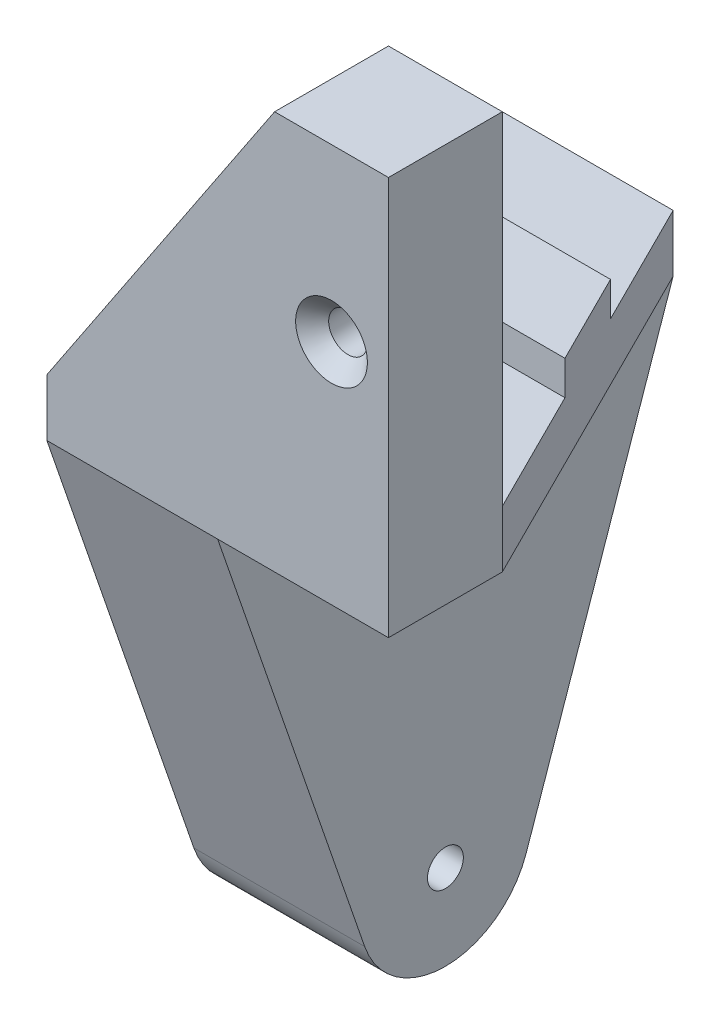
ISO-10303-21;
HEADER;
FILE_DESCRIPTION(('STEP AP214'),'2;1');
FILE_NAME('part.step','',(''),(''),'','','');
FILE_SCHEMA(('AUTOMOTIVE_DESIGN { 1 0 10303 214 1 1 1 1 }'));
ENDSEC;
DATA;
#1=APPLICATION_CONTEXT('core data for automotive mechanical design processes');
#2=APPLICATION_PROTOCOL_DEFINITION('international standard','automotive_design',2000,#1);
#3=PRODUCT_CONTEXT('',#1,'mechanical');
#4=PRODUCT('Part','Part','',(#3));
#5=PRODUCT_RELATED_PRODUCT_CATEGORY('part','',(#4));
#6=PRODUCT_DEFINITION_FORMATION('','',#4);
#7=PRODUCT_DEFINITION_CONTEXT('part definition',#1,'design');
#8=PRODUCT_DEFINITION('design','',#6,#7);
#9=PRODUCT_DEFINITION_SHAPE('','',#8);
#10=(LENGTH_UNIT() NAMED_UNIT(*) SI_UNIT(.MILLI.,.METRE.));
#11=(NAMED_UNIT(*) PLANE_ANGLE_UNIT() SI_UNIT($,.RADIAN.));
#12=(NAMED_UNIT(*) SI_UNIT($,.STERADIAN.) SOLID_ANGLE_UNIT());
#13=UNCERTAINTY_MEASURE_WITH_UNIT(LENGTH_MEASURE(1.E-05),#10,'distance_accuracy_value','');
#14=(GEOMETRIC_REPRESENTATION_CONTEXT(3) GLOBAL_UNCERTAINTY_ASSIGNED_CONTEXT((#13)) GLOBAL_UNIT_ASSIGNED_CONTEXT((#10,
#11,#12)) REPRESENTATION_CONTEXT('',''));
#15=CARTESIAN_POINT('',(0.,0.,0.));
#16=DIRECTION('',(0.,0.,1.));
#17=DIRECTION('',(1.,0.,0.));
#18=AXIS2_PLACEMENT_3D('',#15,#16,#17);
#19=CARTESIAN_POINT('',(0.,-5.,10.));
#20=DIRECTION('',(1.,0.,0.));
#21=DIRECTION('',(0.,0.,-1.));
#22=AXIS2_PLACEMENT_3D('',#19,#20,#21);
#23=PLANE('',#22);
#24=DIRECTION('',(0.,0.,-1.));
#25=VECTOR('',#24,1.);
#26=CARTESIAN_POINT('',(0.,0.,10.));
#27=LINE('',#26,#25);
#28=CARTESIAN_POINT('',(0.,0.,10.));
#29=VERTEX_POINT('',#28);
#30=CARTESIAN_POINT('',(0.,0.,0.));
#31=VERTEX_POINT('',#30);
#32=EDGE_CURVE('E236',#29,#31,#27,.T.);
#33=ORIENTED_EDGE('',*,*,#32,.T.);
#34=DIRECTION('',(0.,0.,-1.));
#35=VECTOR('',#34,1.);
#36=CARTESIAN_POINT('',(0.,0.,10.));
#37=LINE('',#36,#35);
#38=CARTESIAN_POINT('',(0.,0.,-11.));
#39=VERTEX_POINT('',#38);
#40=EDGE_CURVE('E167',#31,#39,#37,.T.);
#41=ORIENTED_EDGE('',*,*,#40,.T.);
#42=DIRECTION('',(0.,-1.,0.));
#43=VECTOR('',#42,1.);
#44=CARTESIAN_POINT('',(0.,3.,-11.));
#45=LINE('',#44,#43);
#46=CARTESIAN_POINT('',(0.,3.,-11.));
#47=VERTEX_POINT('',#46);
#48=EDGE_CURVE('E148',#47,#39,#45,.T.);
#49=ORIENTED_EDGE('',*,*,#48,.F.);
#50=DIRECTION('',(0.,0.,1.));
#51=VECTOR('',#50,1.);
#52=CARTESIAN_POINT('',(0.,3.,-11.));
#53=LINE('',#52,#51);
#54=CARTESIAN_POINT('',(0.,3.,-19.));
#55=VERTEX_POINT('',#54);
#56=EDGE_CURVE('E152',#55,#47,#53,.T.);
#57=ORIENTED_EDGE('',*,*,#56,.F.);
#58=DIRECTION('',(0.,-1.,0.));
#59=VECTOR('',#58,1.);
#60=CARTESIAN_POINT('',(0.,3.,-19.));
#61=LINE('',#60,#59);
#62=CARTESIAN_POINT('',(0.,0.,-19.));
#63=VERTEX_POINT('',#62);
#64=EDGE_CURVE('E308',#55,#63,#61,.T.);
#65=ORIENTED_EDGE('',*,*,#64,.T.);
#66=CARTESIAN_POINT('',(0.,0.,-30.));
#67=VERTEX_POINT('',#66);
#68=EDGE_CURVE('E197',#63,#67,#37,.T.);
#69=ORIENTED_EDGE('',*,*,#68,.T.);
#70=DIRECTION('',(0.,1.,0.));
#71=VECTOR('',#70,1.);
#72=CARTESIAN_POINT('',(0.,-5.,-30.));
#73=LINE('',#72,#71);
#74=CARTESIAN_POINT('',(0.,-5.,-30.));
#75=VERTEX_POINT('',#74);
#76=EDGE_CURVE('E228',#75,#67,#73,.T.);
#77=ORIENTED_EDGE('',*,*,#76,.F.);
#78=DIRECTION('',(0.,-0.945391204802185,0.325937831315534));
#79=VECTOR('',#78,1.);
#80=CARTESIAN_POINT('',(0.,-5.,-30.));
#81=LINE('',#80,#79);
#82=CARTESIAN_POINT('',(0.,-42.4445337348665,-17.0904340360164));
#83=VERTEX_POINT('',#82);
#84=EDGE_CURVE('E168',#75,#83,#81,.T.);
#85=ORIENTED_EDGE('',*,*,#84,.T.);
#86=CARTESIAN_POINT('',(0.,-40.,-10.));
#87=DIRECTION('',(-1.,0.,0.));
#88=DIRECTION('',(0.,0.,1.));
#89=AXIS2_PLACEMENT_3D('',#86,#87,#88);
#90=CIRCLE('',#89,7.5);
#91=CARTESIAN_POINT('',(0.,-42.4445337348665,-2.90956596398362));
#92=VERTEX_POINT('',#91);
#93=EDGE_CURVE('E171',#83,#92,#90,.T.);
#94=ORIENTED_EDGE('',*,*,#93,.T.);
#95=DIRECTION('',(0.,0.945391204802185,0.325937831315534));
#96=VECTOR('',#95,1.);
#97=CARTESIAN_POINT('',(0.,-5.,10.));
#98=LINE('',#97,#96);
#99=CARTESIAN_POINT('',(0.,-5.,10.));
#100=VERTEX_POINT('',#99);
#101=EDGE_CURVE('E181',#92,#100,#98,.T.);
#102=ORIENTED_EDGE('',*,*,#101,.T.);
#103=DIRECTION('',(0.,1.,0.));
#104=VECTOR('',#103,1.);
#105=CARTESIAN_POINT('',(0.,-5.,10.));
#106=LINE('',#105,#104);
#107=EDGE_CURVE('E213',#100,#29,#106,.T.);
#108=ORIENTED_EDGE('',*,*,#107,.T.);
#109=EDGE_LOOP('',(#33,#41,#49,#57,#65,#69,#77,#85,#94,#102,#108));
#110=FACE_BOUND('',#109,.T.);
#111=CARTESIAN_POINT('',(0.,-40.,-10.));
#112=DIRECTION('',(-1.,0.,0.));
#113=DIRECTION('',(0.,0.,1.));
#114=AXIS2_PLACEMENT_3D('',#111,#112,#113);
#115=CIRCLE('',#114,1.575);
#116=CARTESIAN_POINT('',(0.,-40.,-8.425));
#117=VERTEX_POINT('',#116);
#118=EDGE_CURVE('E492',#117,#117,#115,.T.);
#119=ORIENTED_EDGE('',*,*,#118,.F.);
#120=EDGE_LOOP('',(#119));
#121=FACE_BOUND('',#120,.T.);
#122=ADVANCED_FACE('F38',(#110,#121),#23,.F.);
#123=CARTESIAN_POINT('',(0.,0.,0.));
#124=DIRECTION('',(0.,-1.,0.));
#125=DIRECTION('',(0.,0.,-1.));
#126=AXIS2_PLACEMENT_3D('',#123,#124,#125);
#127=PLANE('',#126);
#128=DIRECTION('',(1.,0.,0.));
#129=VECTOR('',#128,1.);
#130=CARTESIAN_POINT('',(0.,0.,-11.));
#131=LINE('',#130,#129);
#132=CARTESIAN_POINT('',(24.5,0.,-11.));
#133=VERTEX_POINT('',#132);
#134=EDGE_CURVE('E255',#39,#133,#131,.T.);
#135=ORIENTED_EDGE('',*,*,#134,.F.);
#136=ORIENTED_EDGE('',*,*,#40,.F.);
#137=DIRECTION('',(1.,0.,0.));
#138=VECTOR('',#137,1.);
#139=CARTESIAN_POINT('',(0.,0.,0.));
#140=LINE('',#139,#138);
#141=CARTESIAN_POINT('',(30.,0.,0.));
#142=VERTEX_POINT('',#141);
#143=EDGE_CURVE('E231',#31,#142,#140,.T.);
#144=ORIENTED_EDGE('',*,*,#143,.T.);
#145=DIRECTION('',(0.447213595499958,0.,0.894427190999916));
#146=VECTOR('',#145,1.);
#147=CARTESIAN_POINT('',(15.,0.,-30.));
#148=LINE('',#147,#146);
#149=EDGE_CURVE('E217',#133,#142,#148,.T.);
#150=ORIENTED_EDGE('',*,*,#149,.F.);
#151=EDGE_LOOP('',(#135,#136,#144,#150));
#152=FACE_BOUND('',#151,.T.);
#153=ADVANCED_FACE('F254',(#152),#127,.F.);
#154=DIRECTION('',(-1.,0.,0.));
#155=VECTOR('',#154,1.);
#156=CARTESIAN_POINT('',(0.,0.,-19.));
#157=LINE('',#156,#155);
#158=CARTESIAN_POINT('',(20.5,0.,-19.));
#159=VERTEX_POINT('',#158);
#160=EDGE_CURVE('E161',#159,#63,#157,.T.);
#161=ORIENTED_EDGE('',*,*,#160,.F.);
#162=CARTESIAN_POINT('',(15.,0.,-30.));
#163=VERTEX_POINT('',#162);
#164=EDGE_CURVE('E205',#163,#159,#148,.T.);
#165=ORIENTED_EDGE('',*,*,#164,.F.);
#166=DIRECTION('',(1.,0.,0.));
#167=VECTOR('',#166,1.);
#168=CARTESIAN_POINT('',(0.,0.,-30.));
#169=LINE('',#168,#167);
#170=EDGE_CURVE('E215',#67,#163,#169,.T.);
#171=ORIENTED_EDGE('',*,*,#170,.F.);
#172=ORIENTED_EDGE('',*,*,#68,.F.);
#173=EDGE_LOOP('',(#161,#165,#171,#172));
#174=FACE_BOUND('',#173,.T.);
#175=ADVANCED_FACE('F279',(#174),#127,.F.);
#176=CARTESIAN_POINT('',(0.,-5.,0.));
#177=DIRECTION('',(0.,-1.,0.));
#178=DIRECTION('',(0.,0.,-1.));
#179=AXIS2_PLACEMENT_3D('',#176,#177,#178);
#180=PLANE('',#179);
#181=DIRECTION('',(-1.,0.,0.));
#182=VECTOR('',#181,1.);
#183=CARTESIAN_POINT('',(0.,-5.,10.));
#184=LINE('',#183,#182);
#185=CARTESIAN_POINT('',(30.,-5.,10.));
#186=VERTEX_POINT('',#185);
#187=CARTESIAN_POINT('',(15.,-5.,10.));
#188=VERTEX_POINT('',#187);
#189=EDGE_CURVE('E210',#186,#188,#184,.T.);
#190=ORIENTED_EDGE('',*,*,#189,.T.);
#191=DIRECTION('',(0.,0.,-1.));
#192=VECTOR('',#191,1.);
#193=CARTESIAN_POINT('',(15.,-5.,-30.));
#194=LINE('',#193,#192);
#195=CARTESIAN_POINT('',(15.,-5.,-30.));
#196=VERTEX_POINT('',#195);
#197=EDGE_CURVE('E177',#188,#196,#194,.T.);
#198=ORIENTED_EDGE('',*,*,#197,.T.);
#199=DIRECTION('',(0.447213595499958,0.,0.894427190999916));
#200=VECTOR('',#199,1.);
#201=CARTESIAN_POINT('',(15.,-5.,-30.));
#202=LINE('',#201,#200);
#203=CARTESIAN_POINT('',(30.,-5.,0.));
#204=VERTEX_POINT('',#203);
#205=EDGE_CURVE('E204',#196,#204,#202,.T.);
#206=ORIENTED_EDGE('',*,*,#205,.T.);
#207=DIRECTION('',(0.,0.,1.));
#208=VECTOR('',#207,1.);
#209=CARTESIAN_POINT('',(30.,-5.,10.));
#210=LINE('',#209,#208);
#211=EDGE_CURVE('E207',#204,#186,#210,.T.);
#212=ORIENTED_EDGE('',*,*,#211,.T.);
#213=EDGE_LOOP('',(#190,#198,#206,#212));
#214=FACE_BOUND('',#213,.T.);
#215=ADVANCED_FACE('F261',(#214),#180,.T.);
#216=CARTESIAN_POINT('',(30.,0.,10.));
#217=DIRECTION('',(-1.,0.,0.));
#218=DIRECTION('',(0.,0.,1.));
#219=AXIS2_PLACEMENT_3D('',#216,#217,#218);
#220=PLANE('',#219);
#221=DIRECTION('',(0.,1.,0.));
#222=VECTOR('',#221,1.);
#223=CARTESIAN_POINT('',(30.,0.,0.));
#224=LINE('',#223,#222);
#225=CARTESIAN_POINT('',(30.,30.,0.));
#226=VERTEX_POINT('',#225);
#227=EDGE_CURVE('E239',#142,#226,#224,.T.);
#228=ORIENTED_EDGE('',*,*,#227,.T.);
#229=DIRECTION('',(0.,0.,-1.));
#230=VECTOR('',#229,1.);
#231=CARTESIAN_POINT('',(30.,30.,10.));
#232=LINE('',#231,#230);
#233=CARTESIAN_POINT('',(30.,30.,10.));
#234=VERTEX_POINT('',#233);
#235=EDGE_CURVE('E11',#234,#226,#232,.T.);
#236=ORIENTED_EDGE('',*,*,#235,.F.);
#237=DIRECTION('',(0.,1.,0.));
#238=VECTOR('',#237,1.);
#239=CARTESIAN_POINT('',(30.,0.,10.));
#240=LINE('',#239,#238);
#241=EDGE_CURVE('E84',#186,#234,#240,.T.);
#242=ORIENTED_EDGE('',*,*,#241,.F.);
#243=ORIENTED_EDGE('',*,*,#211,.F.);
#244=DIRECTION('',(0.,1.,0.));
#245=VECTOR('',#244,1.);
#246=CARTESIAN_POINT('',(30.,-5.,0.));
#247=LINE('',#246,#245);
#248=EDGE_CURVE('E222',#204,#142,#247,.T.);
#249=ORIENTED_EDGE('',*,*,#248,.T.);
#250=EDGE_LOOP('',(#228,#236,#242,#243,#249));
#251=FACE_BOUND('',#250,.T.);
#252=ADVANCED_FACE('F40',(#251),#220,.F.);
#253=CARTESIAN_POINT('',(20.,30.,10.));
#254=DIRECTION('',(0.,-1.,0.));
#255=DIRECTION('',(0.,0.,-1.));
#256=AXIS2_PLACEMENT_3D('',#253,#254,#255);
#257=PLANE('',#256);
#258=DIRECTION('',(-1.,0.,0.));
#259=VECTOR('',#258,1.);
#260=CARTESIAN_POINT('',(20.,30.,0.));
#261=LINE('',#260,#259);
#262=CARTESIAN_POINT('',(20.,30.,0.));
#263=VERTEX_POINT('',#262);
#264=EDGE_CURVE('E241',#226,#263,#261,.T.);
#265=ORIENTED_EDGE('',*,*,#264,.T.);
#266=DIRECTION('',(0.,0.,-1.));
#267=VECTOR('',#266,1.);
#268=CARTESIAN_POINT('',(20.,30.,10.));
#269=LINE('',#268,#267);
#270=CARTESIAN_POINT('',(20.,30.,10.));
#271=VERTEX_POINT('',#270);
#272=EDGE_CURVE('E46',#271,#263,#269,.T.);
#273=ORIENTED_EDGE('',*,*,#272,.F.);
#274=DIRECTION('',(-1.,0.,0.));
#275=VECTOR('',#274,1.);
#276=CARTESIAN_POINT('',(20.,30.,10.));
#277=LINE('',#276,#275);
#278=EDGE_CURVE('E233',#234,#271,#277,.T.);
#279=ORIENTED_EDGE('',*,*,#278,.F.);
#280=ORIENTED_EDGE('',*,*,#235,.T.);
#281=EDGE_LOOP('',(#265,#273,#279,#280));
#282=FACE_BOUND('',#281,.T.);
#283=ADVANCED_FACE('F267',(#282),#257,.F.);
#284=CARTESIAN_POINT('',(0.,0.,10.));
#285=DIRECTION('',(0.832050294337844,-0.554700196225229,0.));
#286=DIRECTION('',(0.554700196225229,0.832050294337844,0.));
#287=AXIS2_PLACEMENT_3D('',#284,#285,#286);
#288=PLANE('',#287);
#289=DIRECTION('',(-0.554700196225229,-0.832050294337844,0.));
#290=VECTOR('',#289,1.);
#291=CARTESIAN_POINT('',(0.,0.,0.));
#292=LINE('',#291,#290);
#293=EDGE_CURVE('E79',#263,#31,#292,.T.);
#294=ORIENTED_EDGE('',*,*,#293,.T.);
#295=ORIENTED_EDGE('',*,*,#32,.F.);
#296=DIRECTION('',(-0.554700196225229,-0.832050294337844,0.));
#297=VECTOR('',#296,1.);
#298=CARTESIAN_POINT('',(0.,0.,10.));
#299=LINE('',#298,#297);
#300=EDGE_CURVE('E62',#271,#29,#299,.T.);
#301=ORIENTED_EDGE('',*,*,#300,.F.);
#302=ORIENTED_EDGE('',*,*,#272,.T.);
#303=EDGE_LOOP('',(#294,#295,#301,#302));
#304=FACE_BOUND('',#303,.T.);
#305=ADVANCED_FACE('F245',(#304),#288,.F.);
#306=CARTESIAN_POINT('',(0.,0.,10.));
#307=DIRECTION('',(0.,0.,1.));
#308=DIRECTION('',(1.,0.,0.));
#309=AXIS2_PLACEMENT_3D('',#306,#307,#308);
#310=PLANE('',#309);
#311=CARTESIAN_POINT('',(25.,15.,10.));
#312=DIRECTION('',(0.,0.,1.));
#313=DIRECTION('',(1.,0.,0.));
#314=AXIS2_PLACEMENT_3D('',#311,#312,#313);
#315=CIRCLE('',#314,3.15);
#316=CARTESIAN_POINT('',(28.15,15.,10.));
#317=VERTEX_POINT('',#316);
#318=EDGE_CURVE('E303',#317,#317,#315,.T.);
#319=ORIENTED_EDGE('',*,*,#318,.F.);
#320=EDGE_LOOP('',(#319));
#321=FACE_BOUND('',#320,.T.);
#322=ORIENTED_EDGE('',*,*,#300,.T.);
#323=ORIENTED_EDGE('',*,*,#107,.F.);
#324=DIRECTION('',(-1.,0.,0.));
#325=VECTOR('',#324,1.);
#326=CARTESIAN_POINT('',(15.,-5.,10.));
#327=LINE('',#326,#325);
#328=EDGE_CURVE('E195',#188,#100,#327,.T.);
#329=ORIENTED_EDGE('',*,*,#328,.F.);
#330=ORIENTED_EDGE('',*,*,#189,.F.);
#331=ORIENTED_EDGE('',*,*,#241,.T.);
#332=ORIENTED_EDGE('',*,*,#278,.T.);
#333=EDGE_LOOP('',(#322,#323,#329,#330,#331,#332));
#334=FACE_BOUND('',#333,.T.);
#335=ADVANCED_FACE('F258',(#321,#334),#310,.T.);
#336=CARTESIAN_POINT('',(0.,0.,0.));
#337=DIRECTION('',(0.,0.,1.));
#338=DIRECTION('',(1.,0.,0.));
#339=AXIS2_PLACEMENT_3D('',#336,#337,#338);
#340=PLANE('',#339);
#341=CARTESIAN_POINT('',(25.,15.,0.));
#342=DIRECTION('',(0.,0.,1.));
#343=DIRECTION('',(1.,0.,0.));
#344=AXIS2_PLACEMENT_3D('',#341,#342,#343);
#345=CIRCLE('',#344,1.7);
#346=CARTESIAN_POINT('',(26.7,15.,0.));
#347=VERTEX_POINT('',#346);
#348=EDGE_CURVE('E297',#347,#347,#345,.T.);
#349=ORIENTED_EDGE('',*,*,#348,.T.);
#350=EDGE_LOOP('',(#349));
#351=FACE_BOUND('',#350,.T.);
#352=ORIENTED_EDGE('',*,*,#143,.F.);
#353=ORIENTED_EDGE('',*,*,#293,.F.);
#354=ORIENTED_EDGE('',*,*,#264,.F.);
#355=ORIENTED_EDGE('',*,*,#227,.F.);
#356=EDGE_LOOP('',(#352,#353,#354,#355));
#357=FACE_BOUND('',#356,.T.);
#358=ADVANCED_FACE('F250',(#351,#357),#340,.F.);
#359=CARTESIAN_POINT('',(0.,-5.,-30.));
#360=DIRECTION('',(0.,0.,1.));
#361=DIRECTION('',(1.,0.,0.));
#362=AXIS2_PLACEMENT_3D('',#359,#360,#361);
#363=PLANE('',#362);
#364=ORIENTED_EDGE('',*,*,#170,.T.);
#365=DIRECTION('',(0.,1.,0.));
#366=VECTOR('',#365,1.);
#367=CARTESIAN_POINT('',(15.,-5.,-30.));
#368=LINE('',#367,#366);
#369=EDGE_CURVE('E225',#196,#163,#368,.T.);
#370=ORIENTED_EDGE('',*,*,#369,.F.);
#371=DIRECTION('',(1.,0.,0.));
#372=VECTOR('',#371,1.);
#373=CARTESIAN_POINT('',(0.,-5.,-30.));
#374=LINE('',#373,#372);
#375=EDGE_CURVE('E201',#75,#196,#374,.T.);
#376=ORIENTED_EDGE('',*,*,#375,.F.);
#377=ORIENTED_EDGE('',*,*,#76,.T.);
#378=EDGE_LOOP('',(#364,#370,#376,#377));
#379=FACE_BOUND('',#378,.T.);
#380=ADVANCED_FACE('F283',(#379),#363,.F.);
#381=CARTESIAN_POINT('',(15.,-5.,-30.));
#382=DIRECTION('',(-0.894427190999916,0.,0.447213595499958));
#383=DIRECTION('',(0.447213595499958,0.,0.894427190999916));
#384=AXIS2_PLACEMENT_3D('',#381,#382,#383);
#385=PLANE('',#384);
#386=ORIENTED_EDGE('',*,*,#164,.T.);
#387=DIRECTION('',(0.,-1.,0.));
#388=VECTOR('',#387,1.);
#389=CARTESIAN_POINT('',(20.5,3.,-19.));
#390=LINE('',#389,#388);
#391=CARTESIAN_POINT('',(20.5,3.,-19.));
#392=VERTEX_POINT('',#391);
#393=EDGE_CURVE('E173',#392,#159,#390,.T.);
#394=ORIENTED_EDGE('',*,*,#393,.F.);
#395=DIRECTION('',(-0.447213595499958,0.,-0.894427190999916));
#396=VECTOR('',#395,1.);
#397=CARTESIAN_POINT('',(20.5,3.,-19.));
#398=LINE('',#397,#396);
#399=CARTESIAN_POINT('',(24.5,3.,-11.));
#400=VERTEX_POINT('',#399);
#401=EDGE_CURVE('E151',#400,#392,#398,.T.);
#402=ORIENTED_EDGE('',*,*,#401,.F.);
#403=DIRECTION('',(0.,-1.,0.));
#404=VECTOR('',#403,1.);
#405=CARTESIAN_POINT('',(24.5,3.,-11.));
#406=LINE('',#405,#404);
#407=EDGE_CURVE('E53',#400,#133,#406,.T.);
#408=ORIENTED_EDGE('',*,*,#407,.T.);
#409=ORIENTED_EDGE('',*,*,#149,.T.);
#410=ORIENTED_EDGE('',*,*,#248,.F.);
#411=ORIENTED_EDGE('',*,*,#205,.F.);
#412=ORIENTED_EDGE('',*,*,#369,.T.);
#413=EDGE_LOOP('',(#386,#394,#402,#408,#409,#410,#411,#412));
#414=FACE_BOUND('',#413,.T.);
#415=ADVANCED_FACE('F293',(#414),#385,.F.);
#416=CARTESIAN_POINT('',(15.,-5.,10.));
#417=DIRECTION('',(0.,-0.325937831315534,0.945391204802185));
#418=DIRECTION('',(0.,-0.945391204802185,-0.325937831315534));
#419=AXIS2_PLACEMENT_3D('',#416,#417,#418);
#420=PLANE('',#419);
#421=ORIENTED_EDGE('',*,*,#101,.F.);
#422=DIRECTION('',(-1.,0.,0.));
#423=VECTOR('',#422,1.);
#424=CARTESIAN_POINT('',(15.,-42.4445337348665,-2.90956596398361));
#425=LINE('',#424,#423);
#426=CARTESIAN_POINT('',(15.,-42.4445337348665,-2.90956596398361));
#427=VERTEX_POINT('',#426);
#428=EDGE_CURVE('E198',#427,#92,#425,.T.);
#429=ORIENTED_EDGE('',*,*,#428,.F.);
#430=DIRECTION('',(0.,0.945391204802185,0.325937831315534));
#431=VECTOR('',#430,1.);
#432=CARTESIAN_POINT('',(15.,-5.,10.));
#433=LINE('',#432,#431);
#434=EDGE_CURVE('E187',#427,#188,#433,.T.);
#435=ORIENTED_EDGE('',*,*,#434,.T.);
#436=ORIENTED_EDGE('',*,*,#328,.T.);
#437=EDGE_LOOP('',(#421,#429,#435,#436));
#438=FACE_BOUND('',#437,.T.);
#439=ADVANCED_FACE('F328',(#438),#420,.T.);
#440=CARTESIAN_POINT('',(15.,-40.,-10.));
#441=DIRECTION('',(-1.,0.,0.));
#442=DIRECTION('',(0.,0.,1.));
#443=AXIS2_PLACEMENT_3D('',#440,#441,#442);
#444=CYLINDRICAL_SURFACE('',#443,7.5);
#445=ORIENTED_EDGE('',*,*,#93,.F.);
#446=DIRECTION('',(-1.,0.,0.));
#447=VECTOR('',#446,1.);
#448=CARTESIAN_POINT('',(15.,-42.4445337348665,-17.0904340360164));
#449=LINE('',#448,#447);
#450=CARTESIAN_POINT('',(15.,-42.4445337348665,-17.0904340360164));
#451=VERTEX_POINT('',#450);
#452=EDGE_CURVE('E189',#451,#83,#449,.T.);
#453=ORIENTED_EDGE('',*,*,#452,.F.);
#454=CARTESIAN_POINT('',(15.,-40.,-10.));
#455=DIRECTION('',(-1.,0.,0.));
#456=DIRECTION('',(0.,0.,1.));
#457=AXIS2_PLACEMENT_3D('',#454,#455,#456);
#458=CIRCLE('',#457,7.5);
#459=EDGE_CURVE('E184',#451,#427,#458,.T.);
#460=ORIENTED_EDGE('',*,*,#459,.T.);
#461=ORIENTED_EDGE('',*,*,#428,.T.);
#462=EDGE_LOOP('',(#445,#453,#460,#461));
#463=FACE_BOUND('',#462,.T.);
#464=ADVANCED_FACE('F326',(#463),#444,.T.);
#465=CARTESIAN_POINT('',(15.,-5.,-30.));
#466=DIRECTION('',(0.,-0.325937831315534,-0.945391204802185));
#467=DIRECTION('',(0.,0.945391204802185,-0.325937831315534));
#468=AXIS2_PLACEMENT_3D('',#465,#466,#467);
#469=PLANE('',#468);
#470=ORIENTED_EDGE('',*,*,#84,.F.);
#471=ORIENTED_EDGE('',*,*,#375,.T.);
#472=DIRECTION('',(0.,-0.945391204802185,0.325937831315534));
#473=VECTOR('',#472,1.);
#474=CARTESIAN_POINT('',(15.,-5.,-30.));
#475=LINE('',#474,#473);
#476=EDGE_CURVE('E180',#196,#451,#475,.T.);
#477=ORIENTED_EDGE('',*,*,#476,.T.);
#478=ORIENTED_EDGE('',*,*,#452,.T.);
#479=EDGE_LOOP('',(#470,#471,#477,#478));
#480=FACE_BOUND('',#479,.T.);
#481=ADVANCED_FACE('F323',(#480),#469,.T.);
#482=CARTESIAN_POINT('',(15.,-40.,-10.));
#483=DIRECTION('',(-1.,0.,0.));
#484=DIRECTION('',(0.,0.,1.));
#485=AXIS2_PLACEMENT_3D('',#482,#483,#484);
#486=PLANE('',#485);
#487=CARTESIAN_POINT('',(15.,-40.,-10.));
#488=DIRECTION('',(-1.,0.,0.));
#489=DIRECTION('',(0.,0.,1.));
#490=AXIS2_PLACEMENT_3D('',#487,#488,#489);
#491=CIRCLE('',#490,1.575);
#492=CARTESIAN_POINT('',(15.,-40.,-8.425));
#493=VERTEX_POINT('',#492);
#494=EDGE_CURVE('E489',#493,#493,#491,.T.);
#495=ORIENTED_EDGE('',*,*,#494,.T.);
#496=EDGE_LOOP('',(#495));
#497=FACE_BOUND('',#496,.T.);
#498=ORIENTED_EDGE('',*,*,#197,.F.);
#499=ORIENTED_EDGE('',*,*,#434,.F.);
#500=ORIENTED_EDGE('',*,*,#459,.F.);
#501=ORIENTED_EDGE('',*,*,#476,.F.);
#502=EDGE_LOOP('',(#498,#499,#500,#501));
#503=FACE_BOUND('',#502,.T.);
#504=ADVANCED_FACE('F330',(#497,#503),#486,.F.);
#505=CARTESIAN_POINT('',(0.,3.,-11.));
#506=DIRECTION('',(0.,0.,-1.));
#507=DIRECTION('',(-1.,0.,0.));
#508=AXIS2_PLACEMENT_3D('',#505,#506,#507);
#509=PLANE('',#508);
#510=ORIENTED_EDGE('',*,*,#134,.T.);
#511=ORIENTED_EDGE('',*,*,#407,.F.);
#512=DIRECTION('',(1.,0.,0.));
#513=VECTOR('',#512,1.);
#514=CARTESIAN_POINT('',(0.,3.,-11.));
#515=LINE('',#514,#513);
#516=EDGE_CURVE('E144',#47,#400,#515,.T.);
#517=ORIENTED_EDGE('',*,*,#516,.F.);
#518=ORIENTED_EDGE('',*,*,#48,.T.);
#519=EDGE_LOOP('',(#510,#511,#517,#518));
#520=FACE_BOUND('',#519,.T.);
#521=ADVANCED_FACE('F146',(#520),#509,.F.);
#522=CARTESIAN_POINT('',(0.,3.,-19.));
#523=DIRECTION('',(0.,0.,1.));
#524=DIRECTION('',(1.,0.,0.));
#525=AXIS2_PLACEMENT_3D('',#522,#523,#524);
#526=PLANE('',#525);
#527=ORIENTED_EDGE('',*,*,#160,.T.);
#528=ORIENTED_EDGE('',*,*,#64,.F.);
#529=DIRECTION('',(-1.,0.,0.));
#530=VECTOR('',#529,1.);
#531=CARTESIAN_POINT('',(0.,3.,-19.));
#532=LINE('',#531,#530);
#533=EDGE_CURVE('E157',#392,#55,#532,.T.);
#534=ORIENTED_EDGE('',*,*,#533,.F.);
#535=ORIENTED_EDGE('',*,*,#393,.T.);
#536=EDGE_LOOP('',(#527,#528,#534,#535));
#537=FACE_BOUND('',#536,.T.);
#538=ADVANCED_FACE('F314',(#537),#526,.F.);
#539=CARTESIAN_POINT('',(0.,3.,0.));
#540=DIRECTION('',(0.,-1.,0.));
#541=DIRECTION('',(0.,0.,-1.));
#542=AXIS2_PLACEMENT_3D('',#539,#540,#541);
#543=PLANE('',#542);
#544=ORIENTED_EDGE('',*,*,#56,.T.);
#545=ORIENTED_EDGE('',*,*,#516,.T.);
#546=ORIENTED_EDGE('',*,*,#401,.T.);
#547=ORIENTED_EDGE('',*,*,#533,.T.);
#548=EDGE_LOOP('',(#544,#545,#546,#547));
#549=FACE_BOUND('',#548,.T.);
#550=ADVANCED_FACE('F155',(#549),#543,.F.);
#551=CARTESIAN_POINT('',(25.,15.,10.));
#552=DIRECTION('',(0.,0.,1.));
#553=DIRECTION('',(1.,0.,0.));
#554=AXIS2_PLACEMENT_3D('',#551,#552,#553);
#555=CYLINDRICAL_SURFACE('',#554,1.7);
#556=ORIENTED_EDGE('',*,*,#348,.F.);
#557=EDGE_LOOP('',(#556));
#558=FACE_BOUND('',#557,.T.);
#559=CARTESIAN_POINT('',(25.,15.,8.55));
#560=DIRECTION('',(0.,0.,1.));
#561=DIRECTION('',(1.,0.,0.));
#562=AXIS2_PLACEMENT_3D('',#559,#560,#561);
#563=CIRCLE('',#562,1.7);
#564=CARTESIAN_POINT('',(26.7,15.,8.55));
#565=VERTEX_POINT('',#564);
#566=EDGE_CURVE('E299',#565,#565,#563,.T.);
#567=ORIENTED_EDGE('',*,*,#566,.T.);
#568=EDGE_LOOP('',(#567));
#569=FACE_BOUND('',#568,.T.);
#570=ADVANCED_FACE('F421',(#558,#569),#555,.F.);
#571=CARTESIAN_POINT('',(25.,15.,10.));
#572=DIRECTION('',(0.,0.,1.));
#573=DIRECTION('',(1.,0.,0.));
#574=AXIS2_PLACEMENT_3D('',#571,#572,#573);
#575=CONICAL_SURFACE('',#574,3.15,0.785398163397448);
#576=ORIENTED_EDGE('',*,*,#566,.F.);
#577=EDGE_LOOP('',(#576));
#578=FACE_BOUND('',#577,.T.);
#579=ORIENTED_EDGE('',*,*,#318,.T.);
#580=EDGE_LOOP('',(#579));
#581=FACE_BOUND('',#580,.T.);
#582=ADVANCED_FACE('F426',(#578,#581),#575,.F.);
#583=CARTESIAN_POINT('',(0.,-40.,-10.));
#584=DIRECTION('',(-1.,0.,0.));
#585=DIRECTION('',(0.,0.,1.));
#586=AXIS2_PLACEMENT_3D('',#583,#584,#585);
#587=CYLINDRICAL_SURFACE('',#586,1.575);
#588=ORIENTED_EDGE('',*,*,#494,.F.);
#589=EDGE_LOOP('',(#588));
#590=FACE_BOUND('',#589,.T.);
#591=ORIENTED_EDGE('',*,*,#118,.T.);
#592=EDGE_LOOP('',(#591));
#593=FACE_BOUND('',#592,.T.);
#594=ADVANCED_FACE('F434',(#590,#593),#587,.F.);
#595=CLOSED_SHELL('',(#122,#153,#175,#215,#252,#283,#305,#335,#358,#380,#415,#439,#464,#481,
#504,#521,#538,#550,#570,#582,#594));
#596=MANIFOLD_SOLID_BREP('B2',#595);
#597=ADVANCED_BREP_SHAPE_REPRESENTATION('',(#18,#596),#14);
#598=SHAPE_DEFINITION_REPRESENTATION(#9,#597);
ENDSEC;
END-ISO-10303-21;
